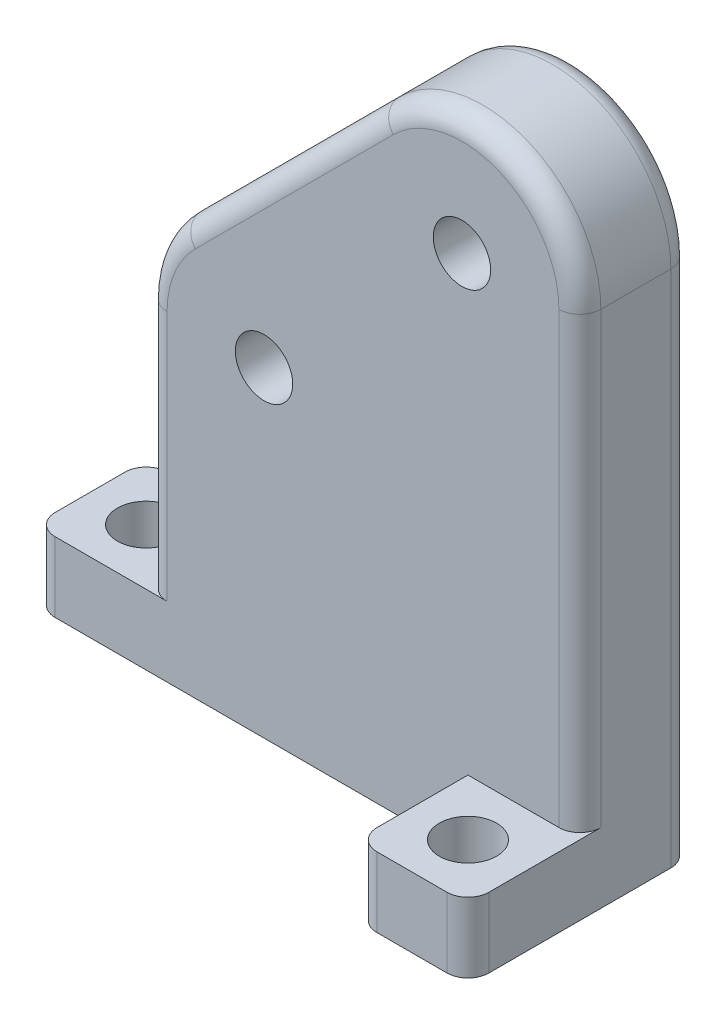
ISO-10303-21;
HEADER;
FILE_DESCRIPTION(('STEP AP214'),'2;1');
FILE_NAME('part.step','',(''),(''),'','','');
FILE_SCHEMA(('AUTOMOTIVE_DESIGN { 1 0 10303 214 1 1 1 1 }'));
ENDSEC;
DATA;
#1=APPLICATION_CONTEXT('core data for automotive mechanical design processes');
#2=APPLICATION_PROTOCOL_DEFINITION('international standard','automotive_design',2000,#1);
#3=PRODUCT_CONTEXT('',#1,'mechanical');
#4=PRODUCT('Part','Part','',(#3));
#5=PRODUCT_RELATED_PRODUCT_CATEGORY('part','',(#4));
#6=PRODUCT_DEFINITION_FORMATION('','',#4);
#7=PRODUCT_DEFINITION_CONTEXT('part definition',#1,'design');
#8=PRODUCT_DEFINITION('design','',#6,#7);
#9=PRODUCT_DEFINITION_SHAPE('','',#8);
#10=(LENGTH_UNIT() NAMED_UNIT(*) SI_UNIT(.MILLI.,.METRE.));
#11=(NAMED_UNIT(*) PLANE_ANGLE_UNIT() SI_UNIT($,.RADIAN.));
#12=(NAMED_UNIT(*) SI_UNIT($,.STERADIAN.) SOLID_ANGLE_UNIT());
#13=UNCERTAINTY_MEASURE_WITH_UNIT(LENGTH_MEASURE(1.E-05),#10,'distance_accuracy_value','');
#14=(GEOMETRIC_REPRESENTATION_CONTEXT(3) GLOBAL_UNCERTAINTY_ASSIGNED_CONTEXT((#13)) GLOBAL_UNIT_ASSIGNED_CONTEXT((#10,
#11,#12)) REPRESENTATION_CONTEXT('',''));
#15=CARTESIAN_POINT('',(0.,0.,0.));
#16=DIRECTION('',(0.,0.,1.));
#17=DIRECTION('',(1.,0.,0.));
#18=AXIS2_PLACEMENT_3D('',#15,#16,#17);
#19=CARTESIAN_POINT('',(16.4289321881346,22.9289321881346,8.));
#20=DIRECTION('',(0.,0.,1.));
#21=DIRECTION('',(1.,0.,0.));
#22=AXIS2_PLACEMENT_3D('',#19,#20,#21);
#23=PLANE('',#22);
#24=DIRECTION('',(0.,-1.,0.));
#25=VECTOR('',#24,1.);
#26=CARTESIAN_POINT('',(9.5,5.,8.));
#27=LINE('',#26,#25);
#28=CARTESIAN_POINT('',(9.49999999999998,22.9289321881346,8.));
#29=VERTEX_POINT('',#28);
#30=CARTESIAN_POINT('',(9.5,5.,8.));
#31=VERTEX_POINT('',#30);
#32=EDGE_CURVE('E315',#29,#31,#27,.T.);
#33=ORIENTED_EDGE('',*,*,#32,.T.);
#34=DIRECTION('',(-1.,0.,0.));
#35=VECTOR('',#34,1.);
#36=CARTESIAN_POINT('',(0.,5.,8.));
#37=LINE('',#36,#35);
#38=CARTESIAN_POINT('',(1.5,5.,8.));
#39=VERTEX_POINT('',#38);
#40=EDGE_CURVE('E195',#31,#39,#37,.T.);
#41=ORIENTED_EDGE('',*,*,#40,.T.);
#42=DIRECTION('',(0.,-1.,0.));
#43=VECTOR('',#42,1.);
#44=CARTESIAN_POINT('',(1.5,0.,8.));
#45=LINE('',#44,#43);
#46=CARTESIAN_POINT('',(1.5,0.,8.));
#47=VERTEX_POINT('',#46);
#48=EDGE_CURVE('E193',#39,#47,#45,.T.);
#49=ORIENTED_EDGE('',*,*,#48,.T.);
#50=DIRECTION('',(1.,0.,0.));
#51=VECTOR('',#50,1.);
#52=CARTESIAN_POINT('',(0.,0.,8.));
#53=LINE('',#52,#51);
#54=CARTESIAN_POINT('',(31.,0.,8.));
#55=VERTEX_POINT('',#54);
#56=EDGE_CURVE('E184',#47,#55,#53,.T.);
#57=ORIENTED_EDGE('',*,*,#56,.T.);
#58=DIRECTION('',(0.,-1.,0.));
#59=VECTOR('',#58,1.);
#60=CARTESIAN_POINT('',(31.,0.,8.));
#61=LINE('',#60,#59);
#62=CARTESIAN_POINT('',(31.,5.,8.));
#63=VERTEX_POINT('',#62);
#64=EDGE_CURVE('E190',#63,#55,#61,.T.);
#65=ORIENTED_EDGE('',*,*,#64,.F.);
#66=DIRECTION('',(-1.,0.,0.));
#67=VECTOR('',#66,1.);
#68=CARTESIAN_POINT('',(0.,5.,8.));
#69=LINE('',#68,#67);
#70=CARTESIAN_POINT('',(37.5,5.,8.));
#71=VERTEX_POINT('',#70);
#72=EDGE_CURVE('E213',#71,#63,#69,.T.);
#73=ORIENTED_EDGE('',*,*,#72,.F.);
#74=DIRECTION('',(0.,1.,0.));
#75=VECTOR('',#74,1.);
#76=CARTESIAN_POINT('',(37.5,37.0710678118656,8.));
#77=LINE('',#76,#75);
#78=CARTESIAN_POINT('',(37.5,37.0710678118656,8.));
#79=VERTEX_POINT('',#78);
#80=EDGE_CURVE('E319',#71,#79,#77,.T.);
#81=ORIENTED_EDGE('',*,*,#80,.T.);
#82=CARTESIAN_POINT('',(30.5710678118654,37.0710678118656,8.));
#83=DIRECTION('',(0.,0.,1.));
#84=DIRECTION('',(1.,0.,0.));
#85=AXIS2_PLACEMENT_3D('',#82,#83,#84);
#86=CIRCLE('',#85,6.92893218813456);
#87=CARTESIAN_POINT('',(25.6715728752537,41.9705627484773,8.));
#88=VERTEX_POINT('',#87);
#89=EDGE_CURVE('E317',#79,#88,#86,.T.);
#90=ORIENTED_EDGE('',*,*,#89,.T.);
#91=DIRECTION('',(-0.707106781186546,-0.70710678118655,0.));
#92=VECTOR('',#91,1.);
#93=CARTESIAN_POINT('',(11.5294372515228,27.8284271247463,8.));
#94=LINE('',#93,#92);
#95=CARTESIAN_POINT('',(11.5294372515228,27.8284271247463,8.));
#96=VERTEX_POINT('',#95);
#97=EDGE_CURVE('E311',#88,#96,#94,.T.);
#98=ORIENTED_EDGE('',*,*,#97,.T.);
#99=CARTESIAN_POINT('',(16.4289321881346,22.9289321881346,8.));
#100=DIRECTION('',(0.,0.,1.));
#101=DIRECTION('',(1.,0.,0.));
#102=AXIS2_PLACEMENT_3D('',#99,#100,#101);
#103=CIRCLE('',#102,6.92893218813458);
#104=EDGE_CURVE('E313',#96,#29,#103,.T.);
#105=ORIENTED_EDGE('',*,*,#104,.T.);
#106=EDGE_LOOP('',(#33,#41,#49,#57,#65,#73,#81,#90,#98,#105));
#107=FACE_BOUND('',#106,.T.);
#108=CARTESIAN_POINT('',(16.4289321881346,22.9289321881346,8.));
#109=DIRECTION('',(0.,0.,1.));
#110=DIRECTION('',(1.,0.,0.));
#111=AXIS2_PLACEMENT_3D('',#108,#109,#110);
#112=CIRCLE('',#111,2.05);
#113=CARTESIAN_POINT('',(18.4789321881346,22.9289321881346,8.));
#114=VERTEX_POINT('',#113);
#115=EDGE_CURVE('E231',#114,#114,#112,.T.);
#116=ORIENTED_EDGE('',*,*,#115,.F.);
#117=EDGE_LOOP('',(#116));
#118=FACE_BOUND('',#117,.T.);
#119=CARTESIAN_POINT('',(30.5710678118654,37.0710678118656,8.));
#120=DIRECTION('',(0.,0.,1.));
#121=DIRECTION('',(-1.,0.,0.));
#122=AXIS2_PLACEMENT_3D('',#119,#120,#121);
#123=CIRCLE('',#122,2.04999999999999);
#124=CARTESIAN_POINT('',(28.5210678118655,37.0710678118656,8.));
#125=VERTEX_POINT('',#124);
#126=EDGE_CURVE('E225',#125,#125,#123,.T.);
#127=ORIENTED_EDGE('',*,*,#126,.F.);
#128=EDGE_LOOP('',(#127));
#129=FACE_BOUND('',#128,.T.);
#130=ADVANCED_FACE('F36',(#107,#118,#129),#23,.T.);
#131=CARTESIAN_POINT('',(16.4289321881346,22.9289321881346,0.));
#132=DIRECTION('',(0.,0.,1.));
#133=DIRECTION('',(1.,0.,0.));
#134=AXIS2_PLACEMENT_3D('',#131,#132,#133);
#135=PLANE('',#134);
#136=CARTESIAN_POINT('',(30.5710678118654,37.0710678118656,0.));
#137=DIRECTION('',(0.,0.,1.));
#138=DIRECTION('',(1.,0.,0.));
#139=AXIS2_PLACEMENT_3D('',#136,#137,#138);
#140=CIRCLE('',#139,6.92893218813456);
#141=CARTESIAN_POINT('',(25.6715728752537,41.9705627484773,0.));
#142=VERTEX_POINT('',#141);
#143=CARTESIAN_POINT('',(37.5,37.0710678118656,0.));
#144=VERTEX_POINT('',#143);
#145=EDGE_CURVE('E285',#142,#144,#140,.F.);
#146=ORIENTED_EDGE('',*,*,#145,.T.);
#147=DIRECTION('',(0.,1.,0.));
#148=VECTOR('',#147,1.);
#149=CARTESIAN_POINT('',(37.5,22.9289321881346,0.));
#150=LINE('',#149,#148);
#151=CARTESIAN_POINT('',(37.5,0.,0.));
#152=VERTEX_POINT('',#151);
#153=EDGE_CURVE('E287',#144,#152,#150,.F.);
#154=ORIENTED_EDGE('',*,*,#153,.T.);
#155=DIRECTION('',(1.,0.,0.));
#156=VECTOR('',#155,1.);
#157=CARTESIAN_POINT('',(0.,0.,0.));
#158=LINE('',#157,#156);
#159=CARTESIAN_POINT('',(1.5,0.,0.));
#160=VERTEX_POINT('',#159);
#161=EDGE_CURVE('E234',#160,#152,#158,.T.);
#162=ORIENTED_EDGE('',*,*,#161,.F.);
#163=DIRECTION('',(0.,-1.,0.));
#164=VECTOR('',#163,1.);
#165=CARTESIAN_POINT('',(1.5,22.9289321881346,0.));
#166=LINE('',#165,#164);
#167=CARTESIAN_POINT('',(1.5,5.,0.));
#168=VERTEX_POINT('',#167);
#169=EDGE_CURVE('E277',#160,#168,#166,.F.);
#170=ORIENTED_EDGE('',*,*,#169,.T.);
#171=DIRECTION('',(-1.,0.,0.));
#172=VECTOR('',#171,1.);
#173=CARTESIAN_POINT('',(0.,5.,0.));
#174=LINE('',#173,#172);
#175=CARTESIAN_POINT('',(9.5,5.,0.));
#176=VERTEX_POINT('',#175);
#177=EDGE_CURVE('E196',#176,#168,#174,.T.);
#178=ORIENTED_EDGE('',*,*,#177,.F.);
#179=DIRECTION('',(0.,-1.,0.));
#180=VECTOR('',#179,1.);
#181=CARTESIAN_POINT('',(9.5,22.9289321881346,0.));
#182=LINE('',#181,#180);
#183=CARTESIAN_POINT('',(9.5,22.9289321881346,0.));
#184=VERTEX_POINT('',#183);
#185=EDGE_CURVE('E279',#176,#184,#182,.F.);
#186=ORIENTED_EDGE('',*,*,#185,.T.);
#187=CARTESIAN_POINT('',(16.4289321881346,22.9289321881346,0.));
#188=DIRECTION('',(0.,0.,1.));
#189=DIRECTION('',(1.,0.,0.));
#190=AXIS2_PLACEMENT_3D('',#187,#188,#189);
#191=CIRCLE('',#190,6.92893218813458);
#192=CARTESIAN_POINT('',(11.5294372515228,27.8284271247462,0.));
#193=VERTEX_POINT('',#192);
#194=EDGE_CURVE('E281',#184,#193,#191,.F.);
#195=ORIENTED_EDGE('',*,*,#194,.T.);
#196=DIRECTION('',(-0.707106781186546,-0.70710678118655,0.));
#197=VECTOR('',#196,1.);
#198=CARTESIAN_POINT('',(11.5294372515228,27.8284271247463,0.));
#199=LINE('',#198,#197);
#200=EDGE_CURVE('E283',#193,#142,#199,.F.);
#201=ORIENTED_EDGE('',*,*,#200,.T.);
#202=EDGE_LOOP('',(#146,#154,#162,#170,#178,#186,#195,#201));
#203=FACE_BOUND('',#202,.T.);
#204=CARTESIAN_POINT('',(16.4289321881346,22.9289321881346,0.));
#205=DIRECTION('',(0.,0.,1.));
#206=DIRECTION('',(1.,0.,0.));
#207=AXIS2_PLACEMENT_3D('',#204,#205,#206);
#208=CIRCLE('',#207,2.05);
#209=CARTESIAN_POINT('',(18.4789321881346,22.9289321881346,0.));
#210=VERTEX_POINT('',#209);
#211=EDGE_CURVE('E228',#210,#210,#208,.T.);
#212=ORIENTED_EDGE('',*,*,#211,.T.);
#213=EDGE_LOOP('',(#212));
#214=FACE_BOUND('',#213,.T.);
#215=CARTESIAN_POINT('',(30.5710678118654,37.0710678118656,0.));
#216=DIRECTION('',(0.,0.,1.));
#217=DIRECTION('',(-1.,0.,0.));
#218=AXIS2_PLACEMENT_3D('',#215,#216,#217);
#219=CIRCLE('',#218,2.04999999999999);
#220=CARTESIAN_POINT('',(28.5210678118655,37.0710678118656,0.));
#221=VERTEX_POINT('',#220);
#222=EDGE_CURVE('E224',#221,#221,#219,.T.);
#223=ORIENTED_EDGE('',*,*,#222,.T.);
#224=EDGE_LOOP('',(#223));
#225=FACE_BOUND('',#224,.T.);
#226=ADVANCED_FACE('F445',(#203,#214,#225),#135,.F.);
#227=CARTESIAN_POINT('',(0.,0.,8.));
#228=DIRECTION('',(1.,0.,0.));
#229=DIRECTION('',(0.,0.,-1.));
#230=AXIS2_PLACEMENT_3D('',#227,#228,#229);
#231=PLANE('',#230);
#232=DIRECTION('',(0.,0.,-1.));
#233=VECTOR('',#232,1.);
#234=CARTESIAN_POINT('',(0.,0.,8.));
#235=LINE('',#234,#233);
#236=CARTESIAN_POINT('',(0.,0.,6.5));
#237=VERTEX_POINT('',#236);
#238=CARTESIAN_POINT('',(0.,0.,1.5));
#239=VERTEX_POINT('',#238);
#240=EDGE_CURVE('E260',#237,#239,#235,.T.);
#241=ORIENTED_EDGE('',*,*,#240,.F.);
#242=DIRECTION('',(0.,-1.,0.));
#243=VECTOR('',#242,1.);
#244=CARTESIAN_POINT('',(0.,5.,6.5));
#245=LINE('',#244,#243);
#246=CARTESIAN_POINT('',(0.,5.,6.5));
#247=VERTEX_POINT('',#246);
#248=EDGE_CURVE('E60',#237,#247,#245,.F.);
#249=ORIENTED_EDGE('',*,*,#248,.T.);
#250=DIRECTION('',(0.,0.,-1.));
#251=VECTOR('',#250,1.);
#252=CARTESIAN_POINT('',(0.,5.,8.));
#253=LINE('',#252,#251);
#254=CARTESIAN_POINT('',(0.,5.,1.5));
#255=VERTEX_POINT('',#254);
#256=EDGE_CURVE('E238',#247,#255,#253,.T.);
#257=ORIENTED_EDGE('',*,*,#256,.T.);
#258=DIRECTION('',(0.,-1.,0.));
#259=VECTOR('',#258,1.);
#260=CARTESIAN_POINT('',(0.,0.,1.5));
#261=LINE('',#260,#259);
#262=EDGE_CURVE('E338',#255,#239,#261,.T.);
#263=ORIENTED_EDGE('',*,*,#262,.T.);
#264=EDGE_LOOP('',(#241,#249,#257,#263));
#265=FACE_BOUND('',#264,.T.);
#266=ADVANCED_FACE('F439',(#265),#231,.F.);
#267=CARTESIAN_POINT('',(0.,0.,8.));
#268=DIRECTION('',(0.,1.,0.));
#269=DIRECTION('',(0.,0.,1.));
#270=AXIS2_PLACEMENT_3D('',#267,#268,#269);
#271=PLANE('',#270);
#272=CARTESIAN_POINT('',(4.,0.,4.));
#273=DIRECTION('',(0.,1.,0.));
#274=DIRECTION('',(-1.,0.,0.));
#275=AXIS2_PLACEMENT_3D('',#272,#273,#274);
#276=CIRCLE('',#275,2.05);
#277=CARTESIAN_POINT('',(1.95,0.,4.));
#278=VERTEX_POINT('',#277);
#279=EDGE_CURVE('E267',#278,#278,#276,.T.);
#280=ORIENTED_EDGE('',*,*,#279,.T.);
#281=EDGE_LOOP('',(#280));
#282=FACE_BOUND('',#281,.T.);
#283=CARTESIAN_POINT('',(35.,0.,12.));
#284=DIRECTION('',(0.,1.,0.));
#285=DIRECTION('',(-1.,0.,0.));
#286=AXIS2_PLACEMENT_3D('',#283,#284,#285);
#287=CIRCLE('',#286,2.04999999999999);
#288=CARTESIAN_POINT('',(32.95,0.,12.));
#289=VERTEX_POINT('',#288);
#290=EDGE_CURVE('E359',#289,#289,#287,.T.);
#291=ORIENTED_EDGE('',*,*,#290,.T.);
#292=EDGE_LOOP('',(#291));
#293=FACE_BOUND('',#292,.T.);
#294=ORIENTED_EDGE('',*,*,#161,.T.);
#295=CARTESIAN_POINT('',(37.5,0.,1.5));
#296=DIRECTION('',(0.,1.,0.));
#297=DIRECTION('',(0.,0.,1.));
#298=AXIS2_PLACEMENT_3D('',#295,#296,#297);
#299=CIRCLE('',#298,1.5);
#300=CARTESIAN_POINT('',(39.,0.,1.5));
#301=VERTEX_POINT('',#300);
#302=EDGE_CURVE('E296',#152,#301,#299,.F.);
#303=ORIENTED_EDGE('',*,*,#302,.T.);
#304=DIRECTION('',(0.,0.,-1.));
#305=VECTOR('',#304,1.);
#306=CARTESIAN_POINT('',(39.,0.,8.));
#307=LINE('',#306,#305);
#308=CARTESIAN_POINT('',(39.,0.,14.5));
#309=VERTEX_POINT('',#308);
#310=EDGE_CURVE('E257',#309,#301,#307,.T.);
#311=ORIENTED_EDGE('',*,*,#310,.F.);
#312=CARTESIAN_POINT('',(37.5,0.,14.5));
#313=DIRECTION('',(0.,1.,0.));
#314=DIRECTION('',(0.,0.,1.));
#315=AXIS2_PLACEMENT_3D('',#312,#313,#314);
#316=CIRCLE('',#315,1.5);
#317=CARTESIAN_POINT('',(37.5,0.,16.));
#318=VERTEX_POINT('',#317);
#319=EDGE_CURVE('E294',#309,#318,#316,.F.);
#320=ORIENTED_EDGE('',*,*,#319,.T.);
#321=DIRECTION('',(1.,0.,0.));
#322=VECTOR('',#321,1.);
#323=CARTESIAN_POINT('',(0.,0.,16.));
#324=LINE('',#323,#322);
#325=CARTESIAN_POINT('',(32.5,0.,16.));
#326=VERTEX_POINT('',#325);
#327=EDGE_CURVE('E216',#326,#318,#324,.T.);
#328=ORIENTED_EDGE('',*,*,#327,.F.);
#329=CARTESIAN_POINT('',(32.5,0.,14.5));
#330=DIRECTION('',(0.,1.,0.));
#331=DIRECTION('',(0.,0.,1.));
#332=AXIS2_PLACEMENT_3D('',#329,#330,#331);
#333=CIRCLE('',#332,1.5);
#334=CARTESIAN_POINT('',(31.,0.,14.5));
#335=VERTEX_POINT('',#334);
#336=EDGE_CURVE('E203',#326,#335,#333,.F.);
#337=ORIENTED_EDGE('',*,*,#336,.T.);
#338=DIRECTION('',(0.,0.,-1.));
#339=VECTOR('',#338,1.);
#340=CARTESIAN_POINT('',(31.,0.,16.));
#341=LINE('',#340,#339);
#342=EDGE_CURVE('E199',#335,#55,#341,.T.);
#343=ORIENTED_EDGE('',*,*,#342,.T.);
#344=ORIENTED_EDGE('',*,*,#56,.F.);
#345=CARTESIAN_POINT('',(1.5,0.,6.5));
#346=DIRECTION('',(0.,1.,0.));
#347=DIRECTION('',(0.,0.,1.));
#348=AXIS2_PLACEMENT_3D('',#345,#346,#347);
#349=CIRCLE('',#348,1.5);
#350=EDGE_CURVE('E291',#47,#237,#349,.F.);
#351=ORIENTED_EDGE('',*,*,#350,.T.);
#352=ORIENTED_EDGE('',*,*,#240,.T.);
#353=CARTESIAN_POINT('',(1.5,0.,1.5));
#354=DIRECTION('',(0.,1.,0.));
#355=DIRECTION('',(0.,0.,1.));
#356=AXIS2_PLACEMENT_3D('',#353,#354,#355);
#357=CIRCLE('',#356,1.5);
#358=EDGE_CURVE('E289',#239,#160,#357,.F.);
#359=ORIENTED_EDGE('',*,*,#358,.T.);
#360=EDGE_LOOP('',(#294,#303,#311,#320,#328,#337,#343,#344,#351,#352,#359));
#361=FACE_BOUND('',#360,.T.);
#362=ADVANCED_FACE('F201',(#282,#293,#361),#271,.F.);
#363=CARTESIAN_POINT('',(39.,0.,8.));
#364=DIRECTION('',(-1.,0.,0.));
#365=DIRECTION('',(0.,0.,1.));
#366=AXIS2_PLACEMENT_3D('',#363,#364,#365);
#367=PLANE('',#366);
#368=ORIENTED_EDGE('',*,*,#310,.T.);
#369=DIRECTION('',(0.,1.,0.));
#370=VECTOR('',#369,1.);
#371=CARTESIAN_POINT('',(39.,0.,1.5));
#372=LINE('',#371,#370);
#373=CARTESIAN_POINT('',(39.,37.0710678118656,1.5));
#374=VERTEX_POINT('',#373);
#375=EDGE_CURVE('E274',#301,#374,#372,.T.);
#376=ORIENTED_EDGE('',*,*,#375,.T.);
#377=DIRECTION('',(0.,0.,-1.));
#378=VECTOR('',#377,1.);
#379=CARTESIAN_POINT('',(39.,37.0710678118656,8.));
#380=LINE('',#379,#378);
#381=CARTESIAN_POINT('',(39.,37.0710678118656,6.5));
#382=VERTEX_POINT('',#381);
#383=EDGE_CURVE('E254',#382,#374,#380,.T.);
#384=ORIENTED_EDGE('',*,*,#383,.F.);
#385=DIRECTION('',(0.,1.,0.));
#386=VECTOR('',#385,1.);
#387=CARTESIAN_POINT('',(39.,5.,6.5));
#388=LINE('',#387,#386);
#389=CARTESIAN_POINT('',(39.,5.,6.5));
#390=VERTEX_POINT('',#389);
#391=EDGE_CURVE('E271',#382,#390,#388,.F.);
#392=ORIENTED_EDGE('',*,*,#391,.T.);
#393=DIRECTION('',(0.,0.,-1.));
#394=VECTOR('',#393,1.);
#395=CARTESIAN_POINT('',(39.,5.,16.));
#396=LINE('',#395,#394);
#397=CARTESIAN_POINT('',(39.,5.,14.5));
#398=VERTEX_POINT('',#397);
#399=EDGE_CURVE('E207',#398,#390,#396,.T.);
#400=ORIENTED_EDGE('',*,*,#399,.F.);
#401=DIRECTION('',(0.,1.,0.));
#402=VECTOR('',#401,1.);
#403=CARTESIAN_POINT('',(39.,0.,14.5));
#404=LINE('',#403,#402);
#405=EDGE_CURVE('E263',#398,#309,#404,.F.);
#406=ORIENTED_EDGE('',*,*,#405,.T.);
#407=EDGE_LOOP('',(#368,#376,#384,#392,#400,#406));
#408=FACE_BOUND('',#407,.T.);
#409=ADVANCED_FACE('F394',(#408),#367,.F.);
#410=CARTESIAN_POINT('',(30.5710678118654,37.0710678118656,8.));
#411=DIRECTION('',(0.,0.,-1.));
#412=DIRECTION('',(-1.,0.,0.));
#413=AXIS2_PLACEMENT_3D('',#410,#411,#412);
#414=CYLINDRICAL_SURFACE('',#413,8.42893218813456);
#415=ORIENTED_EDGE('',*,*,#383,.T.);
#416=CARTESIAN_POINT('',(30.5710678118654,37.0710678118656,1.5));
#417=DIRECTION('',(0.,0.,1.));
#418=DIRECTION('',(1.,0.,0.));
#419=AXIS2_PLACEMENT_3D('',#416,#417,#418);
#420=CIRCLE('',#419,8.42893218813456);
#421=CARTESIAN_POINT('',(24.6109127034739,43.0312229202571,1.5));
#422=VERTEX_POINT('',#421);
#423=EDGE_CURVE('E300',#374,#422,#420,.T.);
#424=ORIENTED_EDGE('',*,*,#423,.T.);
#425=DIRECTION('',(0.,0.,-1.));
#426=VECTOR('',#425,1.);
#427=CARTESIAN_POINT('',(24.6109127034739,43.0312229202571,8.));
#428=LINE('',#427,#426);
#429=CARTESIAN_POINT('',(24.6109127034739,43.0312229202571,6.5));
#430=VERTEX_POINT('',#429);
#431=EDGE_CURVE('E251',#430,#422,#428,.T.);
#432=ORIENTED_EDGE('',*,*,#431,.F.);
#433=CARTESIAN_POINT('',(30.5710678118654,37.0710678118656,6.5));
#434=DIRECTION('',(0.,0.,1.));
#435=DIRECTION('',(1.,0.,0.));
#436=AXIS2_PLACEMENT_3D('',#433,#434,#435);
#437=CIRCLE('',#436,8.42893218813456);
#438=EDGE_CURVE('E298',#430,#382,#437,.F.);
#439=ORIENTED_EDGE('',*,*,#438,.T.);
#440=EDGE_LOOP('',(#415,#424,#432,#439));
#441=FACE_BOUND('',#440,.T.);
#442=ADVANCED_FACE('F391',(#441),#414,.T.);
#443=CARTESIAN_POINT('',(10.468777079743,28.8890872965261,8.));
#444=DIRECTION('',(0.70710678118655,-0.707106781186546,0.));
#445=DIRECTION('',(0.707106781186546,0.70710678118655,0.));
#446=AXIS2_PLACEMENT_3D('',#443,#444,#445);
#447=PLANE('',#446);
#448=ORIENTED_EDGE('',*,*,#431,.T.);
#449=DIRECTION('',(-0.707106781186546,-0.70710678118655,0.));
#450=VECTOR('',#449,1.);
#451=CARTESIAN_POINT('',(10.468777079743,28.8890872965261,1.5));
#452=LINE('',#451,#450);
#453=CARTESIAN_POINT('',(10.468777079743,28.8890872965261,1.5));
#454=VERTEX_POINT('',#453);
#455=EDGE_CURVE('E304',#422,#454,#452,.T.);
#456=ORIENTED_EDGE('',*,*,#455,.T.);
#457=DIRECTION('',(0.,0.,-1.));
#458=VECTOR('',#457,1.);
#459=CARTESIAN_POINT('',(10.468777079743,28.8890872965261,8.));
#460=LINE('',#459,#458);
#461=CARTESIAN_POINT('',(10.468777079743,28.8890872965261,6.5));
#462=VERTEX_POINT('',#461);
#463=EDGE_CURVE('E248',#462,#454,#460,.T.);
#464=ORIENTED_EDGE('',*,*,#463,.F.);
#465=DIRECTION('',(-0.707106781186546,-0.70710678118655,0.));
#466=VECTOR('',#465,1.);
#467=CARTESIAN_POINT('',(24.6109127034739,43.0312229202571,6.5));
#468=LINE('',#467,#466);
#469=EDGE_CURVE('E302',#462,#430,#468,.F.);
#470=ORIENTED_EDGE('',*,*,#469,.T.);
#471=EDGE_LOOP('',(#448,#456,#464,#470));
#472=FACE_BOUND('',#471,.T.);
#473=ADVANCED_FACE('F458',(#472),#447,.F.);
#474=CARTESIAN_POINT('',(16.4289321881346,22.9289321881346,8.));
#475=DIRECTION('',(0.,0.,-1.));
#476=DIRECTION('',(-1.,0.,0.));
#477=AXIS2_PLACEMENT_3D('',#474,#475,#476);
#478=CYLINDRICAL_SURFACE('',#477,8.42893218813458);
#479=ORIENTED_EDGE('',*,*,#463,.T.);
#480=CARTESIAN_POINT('',(16.4289321881346,22.9289321881346,1.5));
#481=DIRECTION('',(0.,0.,1.));
#482=DIRECTION('',(1.,0.,0.));
#483=AXIS2_PLACEMENT_3D('',#480,#481,#482);
#484=CIRCLE('',#483,8.42893218813458);
#485=CARTESIAN_POINT('',(7.99999999999998,22.9289321881346,1.5));
#486=VERTEX_POINT('',#485);
#487=EDGE_CURVE('E308',#454,#486,#484,.T.);
#488=ORIENTED_EDGE('',*,*,#487,.T.);
#489=DIRECTION('',(0.,0.,-1.));
#490=VECTOR('',#489,1.);
#491=CARTESIAN_POINT('',(7.99999999999998,22.9289321881346,8.));
#492=LINE('',#491,#490);
#493=CARTESIAN_POINT('',(7.99999999999998,22.9289321881346,6.5));
#494=VERTEX_POINT('',#493);
#495=EDGE_CURVE('E245',#494,#486,#492,.T.);
#496=ORIENTED_EDGE('',*,*,#495,.F.);
#497=CARTESIAN_POINT('',(16.4289321881346,22.9289321881346,6.5));
#498=DIRECTION('',(0.,0.,1.));
#499=DIRECTION('',(1.,0.,0.));
#500=AXIS2_PLACEMENT_3D('',#497,#498,#499);
#501=CIRCLE('',#500,8.42893218813458);
#502=EDGE_CURVE('E306',#494,#462,#501,.F.);
#503=ORIENTED_EDGE('',*,*,#502,.T.);
#504=EDGE_LOOP('',(#479,#488,#496,#503));
#505=FACE_BOUND('',#504,.T.);
#506=ADVANCED_FACE('F471',(#505),#478,.T.);
#507=CARTESIAN_POINT('',(8.,5.,8.));
#508=DIRECTION('',(1.,0.,0.));
#509=DIRECTION('',(0.,1.,0.));
#510=AXIS2_PLACEMENT_3D('',#507,#508,#509);
#511=PLANE('',#510);
#512=DIRECTION('',(0.,0.,-1.));
#513=VECTOR('',#512,1.);
#514=CARTESIAN_POINT('',(8.,5.,8.));
#515=LINE('',#514,#513);
#516=CARTESIAN_POINT('',(8.,5.,6.5));
#517=VERTEX_POINT('',#516);
#518=CARTESIAN_POINT('',(8.,5.,1.5));
#519=VERTEX_POINT('',#518);
#520=EDGE_CURVE('E242',#517,#519,#515,.T.);
#521=ORIENTED_EDGE('',*,*,#520,.F.);
#522=DIRECTION('',(0.,-1.,0.));
#523=VECTOR('',#522,1.);
#524=CARTESIAN_POINT('',(8.,22.9289321881346,6.5));
#525=LINE('',#524,#523);
#526=EDGE_CURVE('E324',#517,#494,#525,.F.);
#527=ORIENTED_EDGE('',*,*,#526,.T.);
#528=ORIENTED_EDGE('',*,*,#495,.T.);
#529=DIRECTION('',(0.,-1.,0.));
#530=VECTOR('',#529,1.);
#531=CARTESIAN_POINT('',(8.,5.,1.5));
#532=LINE('',#531,#530);
#533=EDGE_CURVE('E322',#486,#519,#532,.T.);
#534=ORIENTED_EDGE('',*,*,#533,.T.);
#535=EDGE_LOOP('',(#521,#527,#528,#534));
#536=FACE_BOUND('',#535,.T.);
#537=ADVANCED_FACE('F433',(#536),#511,.F.);
#538=CARTESIAN_POINT('',(0.,5.,8.));
#539=DIRECTION('',(0.,-1.,0.));
#540=DIRECTION('',(0.,0.,-1.));
#541=AXIS2_PLACEMENT_3D('',#538,#539,#540);
#542=PLANE('',#541);
#543=CARTESIAN_POINT('',(4.,5.,4.));
#544=DIRECTION('',(0.,-1.,0.));
#545=DIRECTION('',(0.,0.,-1.));
#546=AXIS2_PLACEMENT_3D('',#543,#544,#545);
#547=CIRCLE('',#546,2.05);
#548=CARTESIAN_POINT('',(4.,5.,1.95));
#549=VERTEX_POINT('',#548);
#550=EDGE_CURVE('E218',#549,#549,#547,.T.);
#551=ORIENTED_EDGE('',*,*,#550,.T.);
#552=EDGE_LOOP('',(#551));
#553=FACE_BOUND('',#552,.T.);
#554=ORIENTED_EDGE('',*,*,#256,.F.);
#555=CARTESIAN_POINT('',(1.5,5.,6.5));
#556=DIRECTION('',(0.,-1.,0.));
#557=DIRECTION('',(0.,0.,-1.));
#558=AXIS2_PLACEMENT_3D('',#555,#556,#557);
#559=CIRCLE('',#558,1.5);
#560=EDGE_CURVE('E343',#247,#39,#559,.F.);
#561=ORIENTED_EDGE('',*,*,#560,.T.);
#562=ORIENTED_EDGE('',*,*,#40,.F.);
#563=CARTESIAN_POINT('',(9.5,5.,6.5));
#564=DIRECTION('',(0.,-1.,0.));
#565=DIRECTION('',(0.,0.,-1.));
#566=AXIS2_PLACEMENT_3D('',#563,#564,#565);
#567=CIRCLE('',#566,1.5);
#568=EDGE_CURVE('E45',#31,#517,#567,.T.);
#569=ORIENTED_EDGE('',*,*,#568,.T.);
#570=ORIENTED_EDGE('',*,*,#520,.T.);
#571=CARTESIAN_POINT('',(9.5,5.,1.5));
#572=DIRECTION('',(0.,-1.,0.));
#573=DIRECTION('',(0.,0.,-1.));
#574=AXIS2_PLACEMENT_3D('',#571,#572,#573);
#575=CIRCLE('',#574,1.5);
#576=EDGE_CURVE('E11',#519,#176,#575,.T.);
#577=ORIENTED_EDGE('',*,*,#576,.T.);
#578=ORIENTED_EDGE('',*,*,#177,.T.);
#579=CARTESIAN_POINT('',(1.5,5.,1.5));
#580=DIRECTION('',(0.,-1.,0.));
#581=DIRECTION('',(0.,0.,-1.));
#582=AXIS2_PLACEMENT_3D('',#579,#580,#581);
#583=CIRCLE('',#582,1.5);
#584=EDGE_CURVE('E53',#168,#255,#583,.F.);
#585=ORIENTED_EDGE('',*,*,#584,.T.);
#586=EDGE_LOOP('',(#554,#561,#562,#569,#570,#577,#578,#585));
#587=FACE_BOUND('',#586,.T.);
#588=ADVANCED_FACE('F430',(#553,#587),#542,.F.);
#589=CARTESIAN_POINT('',(16.4289321881346,22.9289321881346,8.));
#590=DIRECTION('',(0.,0.,-1.));
#591=DIRECTION('',(-1.,0.,0.));
#592=AXIS2_PLACEMENT_3D('',#589,#590,#591);
#593=CYLINDRICAL_SURFACE('',#592,2.05);
#594=ORIENTED_EDGE('',*,*,#115,.T.);
#595=EDGE_LOOP('',(#594));
#596=FACE_BOUND('',#595,.T.);
#597=ORIENTED_EDGE('',*,*,#211,.F.);
#598=EDGE_LOOP('',(#597));
#599=FACE_BOUND('',#598,.T.);
#600=ADVANCED_FACE('F432',(#596,#599),#593,.F.);
#601=CARTESIAN_POINT('',(30.5710678118654,37.0710678118656,8.));
#602=DIRECTION('',(0.,0.,-1.));
#603=DIRECTION('',(-1.,0.,0.));
#604=AXIS2_PLACEMENT_3D('',#601,#602,#603);
#605=CYLINDRICAL_SURFACE('',#604,2.04999999999999);
#606=ORIENTED_EDGE('',*,*,#126,.T.);
#607=EDGE_LOOP('',(#606));
#608=FACE_BOUND('',#607,.T.);
#609=ORIENTED_EDGE('',*,*,#222,.F.);
#610=EDGE_LOOP('',(#609));
#611=FACE_BOUND('',#610,.T.);
#612=ADVANCED_FACE('F646',(#608,#611),#605,.F.);
#613=CARTESIAN_POINT('',(0.,5.,16.));
#614=DIRECTION('',(0.,-1.,0.));
#615=DIRECTION('',(1.,0.,0.));
#616=AXIS2_PLACEMENT_3D('',#613,#614,#615);
#617=PLANE('',#616);
#618=CARTESIAN_POINT('',(35.,5.,12.));
#619=DIRECTION('',(0.,-1.,0.));
#620=DIRECTION('',(1.,0.,0.));
#621=AXIS2_PLACEMENT_3D('',#618,#619,#620);
#622=CIRCLE('',#621,2.04999999999999);
#623=CARTESIAN_POINT('',(37.05,5.,12.));
#624=VERTEX_POINT('',#623);
#625=EDGE_CURVE('E264',#624,#624,#622,.T.);
#626=ORIENTED_EDGE('',*,*,#625,.T.);
#627=EDGE_LOOP('',(#626));
#628=FACE_BOUND('',#627,.T.);
#629=DIRECTION('',(-1.,0.,0.));
#630=VECTOR('',#629,1.);
#631=CARTESIAN_POINT('',(0.,5.,16.));
#632=LINE('',#631,#630);
#633=CARTESIAN_POINT('',(37.5,5.,16.));
#634=VERTEX_POINT('',#633);
#635=CARTESIAN_POINT('',(32.5,5.,16.));
#636=VERTEX_POINT('',#635);
#637=EDGE_CURVE('E212',#634,#636,#632,.T.);
#638=ORIENTED_EDGE('',*,*,#637,.F.);
#639=CARTESIAN_POINT('',(37.5,5.,14.5));
#640=DIRECTION('',(0.,-1.,0.));
#641=DIRECTION('',(1.,0.,0.));
#642=AXIS2_PLACEMENT_3D('',#639,#640,#641);
#643=CIRCLE('',#642,1.5);
#644=EDGE_CURVE('E334',#634,#398,#643,.F.);
#645=ORIENTED_EDGE('',*,*,#644,.T.);
#646=ORIENTED_EDGE('',*,*,#399,.T.);
#647=CARTESIAN_POINT('',(37.5,5.,6.5));
#648=DIRECTION('',(0.,-1.,0.));
#649=DIRECTION('',(1.,0.,0.));
#650=AXIS2_PLACEMENT_3D('',#647,#648,#649);
#651=CIRCLE('',#650,1.5);
#652=EDGE_CURVE('E345',#390,#71,#651,.T.);
#653=ORIENTED_EDGE('',*,*,#652,.T.);
#654=ORIENTED_EDGE('',*,*,#72,.T.);
#655=DIRECTION('',(0.,0.,-1.));
#656=VECTOR('',#655,1.);
#657=CARTESIAN_POINT('',(31.,5.,16.));
#658=LINE('',#657,#656);
#659=CARTESIAN_POINT('',(31.,5.,14.5));
#660=VERTEX_POINT('',#659);
#661=EDGE_CURVE('E206',#660,#63,#658,.T.);
#662=ORIENTED_EDGE('',*,*,#661,.F.);
#663=CARTESIAN_POINT('',(32.5,5.,14.5));
#664=DIRECTION('',(0.,-1.,0.));
#665=DIRECTION('',(1.,0.,0.));
#666=AXIS2_PLACEMENT_3D('',#663,#664,#665);
#667=CIRCLE('',#666,1.5);
#668=EDGE_CURVE('E332',#660,#636,#667,.F.);
#669=ORIENTED_EDGE('',*,*,#668,.T.);
#670=EDGE_LOOP('',(#638,#645,#646,#653,#654,#662,#669));
#671=FACE_BOUND('',#670,.T.);
#672=ADVANCED_FACE('F403',(#628,#671),#617,.F.);
#673=CARTESIAN_POINT('',(31.,0.,16.));
#674=DIRECTION('',(1.,0.,0.));
#675=DIRECTION('',(0.,0.,-1.));
#676=AXIS2_PLACEMENT_3D('',#673,#674,#675);
#677=PLANE('',#676);
#678=ORIENTED_EDGE('',*,*,#342,.F.);
#679=DIRECTION('',(0.,-1.,0.));
#680=VECTOR('',#679,1.);
#681=CARTESIAN_POINT('',(31.,5.,14.5));
#682=LINE('',#681,#680);
#683=EDGE_CURVE('E336',#335,#660,#682,.F.);
#684=ORIENTED_EDGE('',*,*,#683,.T.);
#685=ORIENTED_EDGE('',*,*,#661,.T.);
#686=ORIENTED_EDGE('',*,*,#64,.T.);
#687=EDGE_LOOP('',(#678,#684,#685,#686));
#688=FACE_BOUND('',#687,.T.);
#689=ADVANCED_FACE('F209',(#688),#677,.F.);
#690=CARTESIAN_POINT('',(0.,0.,16.));
#691=DIRECTION('',(0.,0.,1.));
#692=DIRECTION('',(1.,0.,0.));
#693=AXIS2_PLACEMENT_3D('',#690,#691,#692);
#694=PLANE('',#693);
#695=ORIENTED_EDGE('',*,*,#327,.T.);
#696=DIRECTION('',(0.,1.,0.));
#697=VECTOR('',#696,1.);
#698=CARTESIAN_POINT('',(37.5,5.,16.));
#699=LINE('',#698,#697);
#700=EDGE_CURVE('E329',#318,#634,#699,.T.);
#701=ORIENTED_EDGE('',*,*,#700,.T.);
#702=ORIENTED_EDGE('',*,*,#637,.T.);
#703=DIRECTION('',(0.,-1.,0.));
#704=VECTOR('',#703,1.);
#705=CARTESIAN_POINT('',(32.5,0.,16.));
#706=LINE('',#705,#704);
#707=EDGE_CURVE('E326',#636,#326,#706,.T.);
#708=ORIENTED_EDGE('',*,*,#707,.T.);
#709=EDGE_LOOP('',(#695,#701,#702,#708));
#710=FACE_BOUND('',#709,.T.);
#711=ADVANCED_FACE('F412',(#710),#694,.T.);
#712=CARTESIAN_POINT('',(35.,0.,12.));
#713=DIRECTION('',(0.,1.,0.));
#714=DIRECTION('',(-1.,0.,0.));
#715=AXIS2_PLACEMENT_3D('',#712,#713,#714);
#716=CYLINDRICAL_SURFACE('',#715,2.04999999999999);
#717=ORIENTED_EDGE('',*,*,#290,.F.);
#718=EDGE_LOOP('',(#717));
#719=FACE_BOUND('',#718,.T.);
#720=ORIENTED_EDGE('',*,*,#625,.F.);
#721=EDGE_LOOP('',(#720));
#722=FACE_BOUND('',#721,.T.);
#723=ADVANCED_FACE('F426',(#719,#722),#716,.F.);
#724=CARTESIAN_POINT('',(4.,0.,4.));
#725=DIRECTION('',(0.,1.,0.));
#726=DIRECTION('',(-1.,0.,0.));
#727=AXIS2_PLACEMENT_3D('',#724,#725,#726);
#728=CYLINDRICAL_SURFACE('',#727,2.05);
#729=ORIENTED_EDGE('',*,*,#279,.F.);
#730=EDGE_LOOP('',(#729));
#731=FACE_BOUND('',#730,.T.);
#732=ORIENTED_EDGE('',*,*,#550,.F.);
#733=EDGE_LOOP('',(#732));
#734=FACE_BOUND('',#733,.T.);
#735=ADVANCED_FACE('F422',(#731,#734),#728,.F.);
#736=CARTESIAN_POINT('',(9.5,5.,1.5));
#737=DIRECTION('',(0.,-1.,0.));
#738=DIRECTION('',(1.,0.,0.));
#739=AXIS2_PLACEMENT_3D('',#736,#737,#738);
#740=CYLINDRICAL_SURFACE('',#739,1.5);
#741=ORIENTED_EDGE('',*,*,#576,.F.);
#742=ORIENTED_EDGE('',*,*,#533,.F.);
#743=CARTESIAN_POINT('',(9.5,22.9289321881346,1.5));
#744=DIRECTION('',(0.,1.,0.));
#745=DIRECTION('',(0.,0.,1.));
#746=AXIS2_PLACEMENT_3D('',#743,#744,#745);
#747=CIRCLE('',#746,1.5);
#748=EDGE_CURVE('E356',#184,#486,#747,.T.);
#749=ORIENTED_EDGE('',*,*,#748,.F.);
#750=ORIENTED_EDGE('',*,*,#185,.F.);
#751=EDGE_LOOP('',(#741,#742,#749,#750));
#752=FACE_BOUND('',#751,.T.);
#753=ADVANCED_FACE('F425',(#752),#740,.T.);
#754=CARTESIAN_POINT('',(16.4289321881346,22.9289321881346,1.5));
#755=DIRECTION('',(0.,0.,1.));
#756=DIRECTION('',(1.,0.,0.));
#757=AXIS2_PLACEMENT_3D('',#754,#755,#756);
#758=TOROIDAL_SURFACE('',#757,6.92893218813458,1.5);
#759=ORIENTED_EDGE('',*,*,#748,.T.);
#760=ORIENTED_EDGE('',*,*,#487,.F.);
#761=CARTESIAN_POINT('',(11.5294372515228,27.8284271247462,1.5));
#762=DIRECTION('',(0.707106781186545,0.70710678118655,0.));
#763=DIRECTION('',(-0.70710678118655,0.707106781186545,0.));
#764=AXIS2_PLACEMENT_3D('',#761,#762,#763);
#765=CIRCLE('',#764,1.5);
#766=EDGE_CURVE('E353',#193,#454,#765,.T.);
#767=ORIENTED_EDGE('',*,*,#766,.F.);
#768=ORIENTED_EDGE('',*,*,#194,.F.);
#769=EDGE_LOOP('',(#759,#760,#767,#768));
#770=FACE_BOUND('',#769,.T.);
#771=ADVANCED_FACE('F467',(#770),#758,.T.);
#772=CARTESIAN_POINT('',(11.5294372515228,27.8284271247463,1.5));
#773=DIRECTION('',(-0.707106781186546,-0.70710678118655,0.));
#774=DIRECTION('',(0.70710678118655,-0.707106781186546,0.));
#775=AXIS2_PLACEMENT_3D('',#772,#773,#774);
#776=CYLINDRICAL_SURFACE('',#775,1.5);
#777=ORIENTED_EDGE('',*,*,#766,.T.);
#778=ORIENTED_EDGE('',*,*,#455,.F.);
#779=CARTESIAN_POINT('',(25.6715728752537,41.9705627484773,1.5));
#780=DIRECTION('',(0.707106781186545,0.70710678118655,0.));
#781=DIRECTION('',(-0.70710678118655,0.707106781186545,0.));
#782=AXIS2_PLACEMENT_3D('',#779,#780,#781);
#783=CIRCLE('',#782,1.5);
#784=EDGE_CURVE('E350',#142,#422,#783,.T.);
#785=ORIENTED_EDGE('',*,*,#784,.F.);
#786=ORIENTED_EDGE('',*,*,#200,.F.);
#787=EDGE_LOOP('',(#777,#778,#785,#786));
#788=FACE_BOUND('',#787,.T.);
#789=ADVANCED_FACE('F461',(#788),#776,.T.);
#790=CARTESIAN_POINT('',(30.5710678118654,37.0710678118656,1.5));
#791=DIRECTION('',(0.,0.,1.));
#792=DIRECTION('',(1.,0.,0.));
#793=AXIS2_PLACEMENT_3D('',#790,#791,#792);
#794=TOROIDAL_SURFACE('',#793,6.92893218813456,1.5);
#795=ORIENTED_EDGE('',*,*,#784,.T.);
#796=ORIENTED_EDGE('',*,*,#423,.F.);
#797=CARTESIAN_POINT('',(37.5,37.0710678118656,1.5));
#798=DIRECTION('',(0.,-1.,0.));
#799=DIRECTION('',(0.,0.,-1.));
#800=AXIS2_PLACEMENT_3D('',#797,#798,#799);
#801=CIRCLE('',#800,1.5);
#802=EDGE_CURVE('E348',#144,#374,#801,.T.);
#803=ORIENTED_EDGE('',*,*,#802,.F.);
#804=ORIENTED_EDGE('',*,*,#145,.F.);
#805=EDGE_LOOP('',(#795,#796,#803,#804));
#806=FACE_BOUND('',#805,.T.);
#807=ADVANCED_FACE('F454',(#806),#794,.T.);
#808=CARTESIAN_POINT('',(37.5,0.,1.5));
#809=DIRECTION('',(0.,1.,0.));
#810=DIRECTION('',(0.,0.,1.));
#811=AXIS2_PLACEMENT_3D('',#808,#809,#810);
#812=CYLINDRICAL_SURFACE('',#811,1.5);
#813=ORIENTED_EDGE('',*,*,#302,.F.);
#814=ORIENTED_EDGE('',*,*,#153,.F.);
#815=ORIENTED_EDGE('',*,*,#802,.T.);
#816=ORIENTED_EDGE('',*,*,#375,.F.);
#817=EDGE_LOOP('',(#813,#814,#815,#816));
#818=FACE_BOUND('',#817,.T.);
#819=ADVANCED_FACE('F451',(#818),#812,.T.);
#820=CARTESIAN_POINT('',(9.5,22.9289321881346,6.5));
#821=DIRECTION('',(0.,1.,0.));
#822=DIRECTION('',(-1.,0.,0.));
#823=AXIS2_PLACEMENT_3D('',#820,#821,#822);
#824=CYLINDRICAL_SURFACE('',#823,1.5);
#825=ORIENTED_EDGE('',*,*,#568,.F.);
#826=ORIENTED_EDGE('',*,*,#32,.F.);
#827=CARTESIAN_POINT('',(9.5,22.9289321881346,6.5));
#828=DIRECTION('',(0.,1.,0.));
#829=DIRECTION('',(0.,0.,1.));
#830=AXIS2_PLACEMENT_3D('',#827,#828,#829);
#831=CIRCLE('',#830,1.5);
#832=EDGE_CURVE('E40',#494,#29,#831,.T.);
#833=ORIENTED_EDGE('',*,*,#832,.F.);
#834=ORIENTED_EDGE('',*,*,#526,.F.);
#835=EDGE_LOOP('',(#825,#826,#833,#834));
#836=FACE_BOUND('',#835,.T.);
#837=ADVANCED_FACE('F380',(#836),#824,.T.);
#838=CARTESIAN_POINT('',(16.4289321881346,22.9289321881346,6.5));
#839=DIRECTION('',(0.,0.,1.));
#840=DIRECTION('',(1.,0.,0.));
#841=AXIS2_PLACEMENT_3D('',#838,#839,#840);
#842=TOROIDAL_SURFACE('',#841,6.92893218813458,1.5);
#843=ORIENTED_EDGE('',*,*,#832,.T.);
#844=ORIENTED_EDGE('',*,*,#104,.F.);
#845=CARTESIAN_POINT('',(11.5294372515228,27.8284271247462,6.5));
#846=DIRECTION('',(0.707106781186545,0.70710678118655,0.));
#847=DIRECTION('',(-0.70710678118655,0.707106781186545,0.));
#848=AXIS2_PLACEMENT_3D('',#845,#846,#847);
#849=CIRCLE('',#848,1.5);
#850=EDGE_CURVE('E364',#462,#96,#849,.T.);
#851=ORIENTED_EDGE('',*,*,#850,.F.);
#852=ORIENTED_EDGE('',*,*,#502,.F.);
#853=EDGE_LOOP('',(#843,#844,#851,#852));
#854=FACE_BOUND('',#853,.T.);
#855=ADVANCED_FACE('F375',(#854),#842,.T.);
#856=CARTESIAN_POINT('',(11.5294372515228,27.8284271247463,6.5));
#857=DIRECTION('',(0.707106781186546,0.70710678118655,0.));
#858=DIRECTION('',(-0.70710678118655,0.707106781186546,0.));
#859=AXIS2_PLACEMENT_3D('',#856,#857,#858);
#860=CYLINDRICAL_SURFACE('',#859,1.5);
#861=ORIENTED_EDGE('',*,*,#850,.T.);
#862=ORIENTED_EDGE('',*,*,#97,.F.);
#863=CARTESIAN_POINT('',(25.6715728752537,41.9705627484773,6.5));
#864=DIRECTION('',(0.707106781186545,0.70710678118655,0.));
#865=DIRECTION('',(-0.70710678118655,0.707106781186545,0.));
#866=AXIS2_PLACEMENT_3D('',#863,#864,#865);
#867=CIRCLE('',#866,1.5);
#868=EDGE_CURVE('E362',#430,#88,#867,.T.);
#869=ORIENTED_EDGE('',*,*,#868,.F.);
#870=ORIENTED_EDGE('',*,*,#469,.F.);
#871=EDGE_LOOP('',(#861,#862,#869,#870));
#872=FACE_BOUND('',#871,.T.);
#873=ADVANCED_FACE('F383',(#872),#860,.T.);
#874=CARTESIAN_POINT('',(30.5710678118654,37.0710678118656,6.5));
#875=DIRECTION('',(0.,0.,1.));
#876=DIRECTION('',(1.,0.,0.));
#877=AXIS2_PLACEMENT_3D('',#874,#875,#876);
#878=TOROIDAL_SURFACE('',#877,6.92893218813456,1.5);
#879=ORIENTED_EDGE('',*,*,#868,.T.);
#880=ORIENTED_EDGE('',*,*,#89,.F.);
#881=CARTESIAN_POINT('',(37.5,37.0710678118656,6.5));
#882=DIRECTION('',(0.,-1.,0.));
#883=DIRECTION('',(0.,0.,-1.));
#884=AXIS2_PLACEMENT_3D('',#881,#882,#883);
#885=CIRCLE('',#884,1.5);
#886=EDGE_CURVE('E360',#382,#79,#885,.T.);
#887=ORIENTED_EDGE('',*,*,#886,.F.);
#888=ORIENTED_EDGE('',*,*,#438,.F.);
#889=EDGE_LOOP('',(#879,#880,#887,#888));
#890=FACE_BOUND('',#889,.T.);
#891=ADVANCED_FACE('F386',(#890),#878,.T.);
#892=CARTESIAN_POINT('',(37.5,22.9289321881346,6.5));
#893=DIRECTION('',(0.,-1.,0.));
#894=DIRECTION('',(0.,0.,-1.));
#895=AXIS2_PLACEMENT_3D('',#892,#893,#894);
#896=CYLINDRICAL_SURFACE('',#895,1.5);
#897=ORIENTED_EDGE('',*,*,#652,.F.);
#898=ORIENTED_EDGE('',*,*,#391,.F.);
#899=ORIENTED_EDGE('',*,*,#886,.T.);
#900=ORIENTED_EDGE('',*,*,#80,.F.);
#901=EDGE_LOOP('',(#897,#898,#899,#900));
#902=FACE_BOUND('',#901,.T.);
#903=ADVANCED_FACE('F399',(#902),#896,.T.);
#904=CARTESIAN_POINT('',(37.5,0.,14.5));
#905=DIRECTION('',(0.,-1.,0.));
#906=DIRECTION('',(0.,0.,-1.));
#907=AXIS2_PLACEMENT_3D('',#904,#905,#906);
#908=CYLINDRICAL_SURFACE('',#907,1.5);
#909=ORIENTED_EDGE('',*,*,#319,.F.);
#910=ORIENTED_EDGE('',*,*,#405,.F.);
#911=ORIENTED_EDGE('',*,*,#644,.F.);
#912=ORIENTED_EDGE('',*,*,#700,.F.);
#913=EDGE_LOOP('',(#909,#910,#911,#912));
#914=FACE_BOUND('',#913,.T.);
#915=ADVANCED_FACE('F408',(#914),#908,.T.);
#916=CARTESIAN_POINT('',(32.5,0.,14.5));
#917=DIRECTION('',(0.,1.,0.));
#918=DIRECTION('',(0.,0.,1.));
#919=AXIS2_PLACEMENT_3D('',#916,#917,#918);
#920=CYLINDRICAL_SURFACE('',#919,1.5);
#921=ORIENTED_EDGE('',*,*,#668,.F.);
#922=ORIENTED_EDGE('',*,*,#683,.F.);
#923=ORIENTED_EDGE('',*,*,#336,.F.);
#924=ORIENTED_EDGE('',*,*,#707,.F.);
#925=EDGE_LOOP('',(#921,#922,#923,#924));
#926=FACE_BOUND('',#925,.T.);
#927=ADVANCED_FACE('F560',(#926),#920,.T.);
#928=CARTESIAN_POINT('',(1.5,22.9289321881346,6.5));
#929=DIRECTION('',(0.,1.,0.));
#930=DIRECTION('',(0.,0.,1.));
#931=AXIS2_PLACEMENT_3D('',#928,#929,#930);
#932=CYLINDRICAL_SURFACE('',#931,1.5);
#933=ORIENTED_EDGE('',*,*,#560,.F.);
#934=ORIENTED_EDGE('',*,*,#248,.F.);
#935=ORIENTED_EDGE('',*,*,#350,.F.);
#936=ORIENTED_EDGE('',*,*,#48,.F.);
#937=EDGE_LOOP('',(#933,#934,#935,#936));
#938=FACE_BOUND('',#937,.T.);
#939=ADVANCED_FACE('F438',(#938),#932,.T.);
#940=CARTESIAN_POINT('',(1.5,0.,1.5));
#941=DIRECTION('',(0.,-1.,0.));
#942=DIRECTION('',(0.,0.,-1.));
#943=AXIS2_PLACEMENT_3D('',#940,#941,#942);
#944=CYLINDRICAL_SURFACE('',#943,1.5);
#945=ORIENTED_EDGE('',*,*,#584,.F.);
#946=ORIENTED_EDGE('',*,*,#169,.F.);
#947=ORIENTED_EDGE('',*,*,#358,.F.);
#948=ORIENTED_EDGE('',*,*,#262,.F.);
#949=EDGE_LOOP('',(#945,#946,#947,#948));
#950=FACE_BOUND('',#949,.T.);
#951=ADVANCED_FACE('F38',(#950),#944,.T.);
#952=CLOSED_SHELL('',(#130,#226,#266,#362,#409,#442,#473,#506,#537,#588,#600,#612,#672,#689,
#711,#723,#735,#753,#771,#789,#807,#819,#837,#855,#873,#891,#903,#915,#927,#939,#951));
#953=MANIFOLD_SOLID_BREP('B2',#952);
#954=ADVANCED_BREP_SHAPE_REPRESENTATION('',(#18,#953),#14);
#955=SHAPE_DEFINITION_REPRESENTATION(#9,#954);
ENDSEC;
END-ISO-10303-21;
